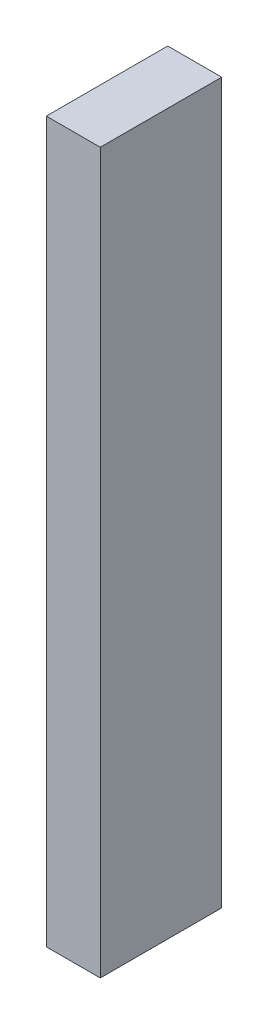
ISO-10303-21;
HEADER;
FILE_DESCRIPTION(('STEP AP214'),'2;1');
FILE_NAME('part.step','',(''),(''),'','','');
FILE_SCHEMA(('AUTOMOTIVE_DESIGN { 1 0 10303 214 1 1 1 1 }'));
ENDSEC;
DATA;
#1=APPLICATION_CONTEXT('core data for automotive mechanical design processes');
#2=APPLICATION_PROTOCOL_DEFINITION('international standard','automotive_design',2000,#1);
#3=PRODUCT_CONTEXT('',#1,'mechanical');
#4=PRODUCT('Part','Part','',(#3));
#5=PRODUCT_RELATED_PRODUCT_CATEGORY('part','',(#4));
#6=PRODUCT_DEFINITION_FORMATION('','',#4);
#7=PRODUCT_DEFINITION_CONTEXT('part definition',#1,'design');
#8=PRODUCT_DEFINITION('design','',#6,#7);
#9=PRODUCT_DEFINITION_SHAPE('','',#8);
#10=(LENGTH_UNIT() NAMED_UNIT(*) SI_UNIT(.MILLI.,.METRE.));
#11=(NAMED_UNIT(*) PLANE_ANGLE_UNIT() SI_UNIT($,.RADIAN.));
#12=(NAMED_UNIT(*) SI_UNIT($,.STERADIAN.) SOLID_ANGLE_UNIT());
#13=UNCERTAINTY_MEASURE_WITH_UNIT(LENGTH_MEASURE(1.E-05),#10,'distance_accuracy_value','');
#14=(GEOMETRIC_REPRESENTATION_CONTEXT(3) GLOBAL_UNCERTAINTY_ASSIGNED_CONTEXT((#13)) GLOBAL_UNIT_ASSIGNED_CONTEXT((#10,
#11,#12)) REPRESENTATION_CONTEXT('',''));
#15=CARTESIAN_POINT('',(0.,0.,0.));
#16=DIRECTION('',(0.,0.,1.));
#17=DIRECTION('',(1.,0.,0.));
#18=AXIS2_PLACEMENT_3D('',#15,#16,#17);
#19=CARTESIAN_POINT('',(-10.8340585797146,80.,-105.756692970029));
#20=DIRECTION('',(-1.,0.,0.));
#21=DIRECTION('',(0.,0.,1.));
#22=AXIS2_PLACEMENT_3D('',#19,#20,#21);
#23=PLANE('',#22);
#24=DIRECTION('',(0.,0.,-1.));
#25=VECTOR('',#24,1.);
#26=CARTESIAN_POINT('',(-10.8340585797146,0.,-105.756692970029));
#27=LINE('',#26,#25);
#28=CARTESIAN_POINT('',(-10.8340585797146,0.,-92.2566929700289));
#29=VERTEX_POINT('',#28);
#30=CARTESIAN_POINT('',(-10.8340585797146,0.,-105.756692970029));
#31=VERTEX_POINT('',#30);
#32=EDGE_CURVE('E114',#29,#31,#27,.T.);
#33=ORIENTED_EDGE('',*,*,#32,.T.);
#34=DIRECTION('',(0.,-1.,0.));
#35=VECTOR('',#34,1.);
#36=CARTESIAN_POINT('',(-10.8340585797146,80.,-105.756692970029));
#37=LINE('',#36,#35);
#38=CARTESIAN_POINT('',(-10.8340585797146,80.,-105.756692970029));
#39=VERTEX_POINT('',#38);
#40=EDGE_CURVE('E11',#39,#31,#37,.T.);
#41=ORIENTED_EDGE('',*,*,#40,.F.);
#42=DIRECTION('',(0.,0.,-1.));
#43=VECTOR('',#42,1.);
#44=CARTESIAN_POINT('',(-10.8340585797146,80.,-105.756692970029));
#45=LINE('',#44,#43);
#46=CARTESIAN_POINT('',(-10.8340585797146,80.,-92.2566929700289));
#47=VERTEX_POINT('',#46);
#48=EDGE_CURVE('E95',#47,#39,#45,.T.);
#49=ORIENTED_EDGE('',*,*,#48,.F.);
#50=DIRECTION('',(0.,-1.,0.));
#51=VECTOR('',#50,1.);
#52=CARTESIAN_POINT('',(-10.8340585797146,80.,-92.2566929700289));
#53=LINE('',#52,#51);
#54=EDGE_CURVE('E110',#47,#29,#53,.T.);
#55=ORIENTED_EDGE('',*,*,#54,.T.);
#56=EDGE_LOOP('',(#33,#41,#49,#55));
#57=FACE_BOUND('',#56,.T.);
#58=ADVANCED_FACE('F43',(#57),#23,.F.);
#59=CARTESIAN_POINT('',(-10.8340585797146,80.,-105.756692970029));
#60=DIRECTION('',(0.,0.,1.));
#61=DIRECTION('',(1.,0.,0.));
#62=AXIS2_PLACEMENT_3D('',#59,#60,#61);
#63=PLANE('',#62);
#64=DIRECTION('',(-1.,0.,0.));
#65=VECTOR('',#64,1.);
#66=CARTESIAN_POINT('',(-10.8340585797146,0.,-105.756692970029));
#67=LINE('',#66,#65);
#68=CARTESIAN_POINT('',(-16.8340585797146,0.,-105.756692970029));
#69=VERTEX_POINT('',#68);
#70=EDGE_CURVE('E100',#31,#69,#67,.T.);
#71=ORIENTED_EDGE('',*,*,#70,.T.);
#72=DIRECTION('',(0.,-1.,0.));
#73=VECTOR('',#72,1.);
#74=CARTESIAN_POINT('',(-16.8340585797146,80.,-105.756692970029));
#75=LINE('',#74,#73);
#76=CARTESIAN_POINT('',(-16.8340585797146,80.,-105.756692970029));
#77=VERTEX_POINT('',#76);
#78=EDGE_CURVE('E52',#77,#69,#75,.T.);
#79=ORIENTED_EDGE('',*,*,#78,.F.);
#80=DIRECTION('',(-1.,0.,0.));
#81=VECTOR('',#80,1.);
#82=CARTESIAN_POINT('',(-10.8340585797146,80.,-105.756692970029));
#83=LINE('',#82,#81);
#84=EDGE_CURVE('E90',#39,#77,#83,.T.);
#85=ORIENTED_EDGE('',*,*,#84,.F.);
#86=ORIENTED_EDGE('',*,*,#40,.T.);
#87=EDGE_LOOP('',(#71,#79,#85,#86));
#88=FACE_BOUND('',#87,.T.);
#89=ADVANCED_FACE('F99',(#88),#63,.F.);
#90=CARTESIAN_POINT('',(-16.8340585797146,80.,-105.756692970029));
#91=DIRECTION('',(1.,0.,0.));
#92=DIRECTION('',(0.,0.,-1.));
#93=AXIS2_PLACEMENT_3D('',#90,#91,#92);
#94=PLANE('',#93);
#95=DIRECTION('',(0.,0.,1.));
#96=VECTOR('',#95,1.);
#97=CARTESIAN_POINT('',(-16.8340585797146,0.,-105.756692970029));
#98=LINE('',#97,#96);
#99=CARTESIAN_POINT('',(-16.8340585797146,0.,-92.2566929700289));
#100=VERTEX_POINT('',#99);
#101=EDGE_CURVE('E77',#69,#100,#98,.T.);
#102=ORIENTED_EDGE('',*,*,#101,.T.);
#103=DIRECTION('',(0.,-1.,0.));
#104=VECTOR('',#103,1.);
#105=CARTESIAN_POINT('',(-16.8340585797146,80.,-92.2566929700289));
#106=LINE('',#105,#104);
#107=CARTESIAN_POINT('',(-16.8340585797146,80.,-92.2566929700289));
#108=VERTEX_POINT('',#107);
#109=EDGE_CURVE('E102',#108,#100,#106,.T.);
#110=ORIENTED_EDGE('',*,*,#109,.F.);
#111=DIRECTION('',(0.,0.,1.));
#112=VECTOR('',#111,1.);
#113=CARTESIAN_POINT('',(-16.8340585797146,80.,-105.756692970029));
#114=LINE('',#113,#112);
#115=EDGE_CURVE('E93',#77,#108,#114,.T.);
#116=ORIENTED_EDGE('',*,*,#115,.F.);
#117=ORIENTED_EDGE('',*,*,#78,.T.);
#118=EDGE_LOOP('',(#102,#110,#116,#117));
#119=FACE_BOUND('',#118,.T.);
#120=ADVANCED_FACE('F103',(#119),#94,.F.);
#121=CARTESIAN_POINT('',(-10.8340585797146,80.,-92.2566929700289));
#122=DIRECTION('',(0.,0.,-1.));
#123=DIRECTION('',(-1.,0.,0.));
#124=AXIS2_PLACEMENT_3D('',#121,#122,#123);
#125=PLANE('',#124);
#126=DIRECTION('',(1.,0.,0.));
#127=VECTOR('',#126,1.);
#128=CARTESIAN_POINT('',(-10.8340585797146,0.,-92.2566929700289));
#129=LINE('',#128,#127);
#130=EDGE_CURVE('E83',#100,#29,#129,.T.);
#131=ORIENTED_EDGE('',*,*,#130,.T.);
#132=ORIENTED_EDGE('',*,*,#54,.F.);
#133=DIRECTION('',(1.,0.,0.));
#134=VECTOR('',#133,1.);
#135=CARTESIAN_POINT('',(-10.8340585797146,80.,-92.2566929700289));
#136=LINE('',#135,#134);
#137=EDGE_CURVE('E60',#108,#47,#136,.T.);
#138=ORIENTED_EDGE('',*,*,#137,.F.);
#139=ORIENTED_EDGE('',*,*,#109,.T.);
#140=EDGE_LOOP('',(#131,#132,#138,#139));
#141=FACE_BOUND('',#140,.T.);
#142=ADVANCED_FACE('F126',(#141),#125,.F.);
#143=CARTESIAN_POINT('',(0.,80.,0.));
#144=DIRECTION('',(0.,-1.,0.));
#145=DIRECTION('',(0.,0.,-1.));
#146=AXIS2_PLACEMENT_3D('',#143,#144,#145);
#147=PLANE('',#146);
#148=ORIENTED_EDGE('',*,*,#48,.T.);
#149=ORIENTED_EDGE('',*,*,#84,.T.);
#150=ORIENTED_EDGE('',*,*,#115,.T.);
#151=ORIENTED_EDGE('',*,*,#137,.T.);
#152=EDGE_LOOP('',(#148,#149,#150,#151));
#153=FACE_BOUND('',#152,.T.);
#154=ADVANCED_FACE('F91',(#153),#147,.F.);
#155=CARTESIAN_POINT('',(0.,0.,0.));
#156=DIRECTION('',(0.,-1.,0.));
#157=DIRECTION('',(0.,0.,-1.));
#158=AXIS2_PLACEMENT_3D('',#155,#156,#157);
#159=PLANE('',#158);
#160=ORIENTED_EDGE('',*,*,#32,.F.);
#161=ORIENTED_EDGE('',*,*,#130,.F.);
#162=ORIENTED_EDGE('',*,*,#101,.F.);
#163=ORIENTED_EDGE('',*,*,#70,.F.);
#164=EDGE_LOOP('',(#160,#161,#162,#163));
#165=FACE_BOUND('',#164,.T.);
#166=ADVANCED_FACE('F129',(#165),#159,.T.);
#167=CLOSED_SHELL('',(#58,#89,#120,#142,#154,#166));
#168=MANIFOLD_SOLID_BREP('B2',#167);
#169=ADVANCED_BREP_SHAPE_REPRESENTATION('',(#18,#168),#14);
#170=SHAPE_DEFINITION_REPRESENTATION(#9,#169);
ENDSEC;
END-ISO-10303-21;
